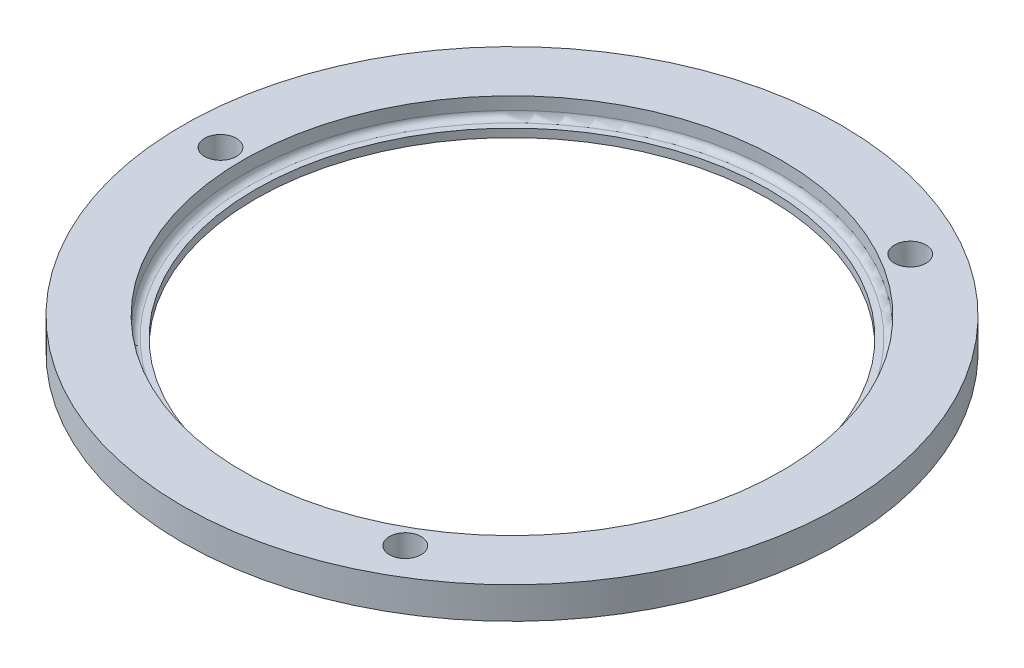
ISO-10303-21;
HEADER;
FILE_DESCRIPTION(('STEP AP214'),'2;1');
FILE_NAME('part.step','',(''),(''),'','','');
FILE_SCHEMA(('AUTOMOTIVE_DESIGN { 1 0 10303 214 1 1 1 1 }'));
ENDSEC;
DATA;
#1=APPLICATION_CONTEXT('core data for automotive mechanical design processes');
#2=APPLICATION_PROTOCOL_DEFINITION('international standard','automotive_design',2000,#1);
#3=PRODUCT_CONTEXT('',#1,'mechanical');
#4=PRODUCT('Part','Part','',(#3));
#5=PRODUCT_RELATED_PRODUCT_CATEGORY('part','',(#4));
#6=PRODUCT_DEFINITION_FORMATION('','',#4);
#7=PRODUCT_DEFINITION_CONTEXT('part definition',#1,'design');
#8=PRODUCT_DEFINITION('design','',#6,#7);
#9=PRODUCT_DEFINITION_SHAPE('','',#8);
#10=(LENGTH_UNIT() NAMED_UNIT(*) SI_UNIT(.MILLI.,.METRE.));
#11=(NAMED_UNIT(*) PLANE_ANGLE_UNIT() SI_UNIT($,.RADIAN.));
#12=(NAMED_UNIT(*) SI_UNIT($,.STERADIAN.) SOLID_ANGLE_UNIT());
#13=UNCERTAINTY_MEASURE_WITH_UNIT(LENGTH_MEASURE(1.E-05),#10,'distance_accuracy_value','');
#14=(GEOMETRIC_REPRESENTATION_CONTEXT(3) GLOBAL_UNCERTAINTY_ASSIGNED_CONTEXT((#13)) GLOBAL_UNIT_ASSIGNED_CONTEXT((#10,
#11,#12)) REPRESENTATION_CONTEXT('',''));
#15=CARTESIAN_POINT('',(0.,0.,0.));
#16=DIRECTION('',(0.,0.,1.));
#17=DIRECTION('',(1.,0.,0.));
#18=AXIS2_PLACEMENT_3D('',#15,#16,#17);
#19=CARTESIAN_POINT('',(42.5,4.14913308704831,0.));
#20=DIRECTION('',(0.,1.,0.));
#21=DIRECTION('',(0.,0.,1.));
#22=AXIS2_PLACEMENT_3D('',#19,#20,#21);
#23=PLANE('',#22);
#24=CARTESIAN_POINT('',(22.9999999999996,4.14913308704831,39.8371685740844));
#25=DIRECTION('',(0.,1.,0.));
#26=DIRECTION('',(0.,0.,1.));
#27=AXIS2_PLACEMENT_3D('',#24,#25,#26);
#28=CIRCLE('',#27,2.5);
#29=CARTESIAN_POINT('',(22.9999999999996,4.14913308704831,42.3371685740844));
#30=VERTEX_POINT('',#29);
#31=EDGE_CURVE('E210',#30,#30,#28,.T.);
#32=ORIENTED_EDGE('',*,*,#31,.F.);
#33=EDGE_LOOP('',(#32));
#34=FACE_BOUND('',#33,.T.);
#35=CARTESIAN_POINT('',(23.0000000000002,4.14913308704831,-39.8371685740841));
#36=DIRECTION('',(0.,1.,0.));
#37=DIRECTION('',(0.,0.,1.));
#38=AXIS2_PLACEMENT_3D('',#35,#36,#37);
#39=CIRCLE('',#38,2.5);
#40=CARTESIAN_POINT('',(23.0000000000002,4.14913308704831,-37.3371685740841));
#41=VERTEX_POINT('',#40);
#42=EDGE_CURVE('E211',#41,#41,#39,.T.);
#43=ORIENTED_EDGE('',*,*,#42,.F.);
#44=EDGE_LOOP('',(#43));
#45=FACE_BOUND('',#44,.T.);
#46=CARTESIAN_POINT('',(-46.,4.14913308704831,0.));
#47=DIRECTION('',(0.,1.,0.));
#48=DIRECTION('',(0.,0.,1.));
#49=AXIS2_PLACEMENT_3D('',#46,#47,#48);
#50=CIRCLE('',#49,2.5);
#51=CARTESIAN_POINT('',(-46.,4.14913308704831,2.5));
#52=VERTEX_POINT('',#51);
#53=EDGE_CURVE('E214',#52,#52,#50,.T.);
#54=ORIENTED_EDGE('',*,*,#53,.F.);
#55=EDGE_LOOP('',(#54));
#56=FACE_BOUND('',#55,.T.);
#57=CARTESIAN_POINT('',(0.,4.14913308704831,0.));
#58=DIRECTION('',(0.,-1.,0.));
#59=DIRECTION('',(0.,0.,-1.));
#60=AXIS2_PLACEMENT_3D('',#57,#58,#59);
#61=CIRCLE('',#60,42.5);
#62=CARTESIAN_POINT('',(0.,4.14913308704831,-42.5));
#63=VERTEX_POINT('',#62);
#64=EDGE_CURVE('E119',#63,#63,#61,.T.);
#65=ORIENTED_EDGE('',*,*,#64,.T.);
#66=EDGE_LOOP('',(#65));
#67=FACE_BOUND('',#66,.T.);
#68=CARTESIAN_POINT('',(0.,4.14913308704831,0.));
#69=DIRECTION('',(0.,-1.,0.));
#70=DIRECTION('',(0.,0.,-1.));
#71=AXIS2_PLACEMENT_3D('',#68,#69,#70);
#72=CIRCLE('',#71,52.);
#73=CARTESIAN_POINT('',(0.,4.14913308704831,-52.));
#74=VERTEX_POINT('',#73);
#75=EDGE_CURVE('E122',#74,#74,#72,.T.);
#76=ORIENTED_EDGE('',*,*,#75,.F.);
#77=EDGE_LOOP('',(#76));
#78=FACE_BOUND('',#77,.T.);
#79=ADVANCED_FACE('F31',(#34,#45,#56,#67,#78),#23,.T.);
#80=CARTESIAN_POINT('',(0.,-12.6426525828884,0.));
#81=DIRECTION('',(0.,-1.,0.));
#82=DIRECTION('',(0.,0.,-1.));
#83=AXIS2_PLACEMENT_3D('',#80,#81,#82);
#84=CYLINDRICAL_SURFACE('',#83,42.5);
#85=CARTESIAN_POINT('',(0.,2.14913308704831,0.));
#86=DIRECTION('',(0.,1.,0.));
#87=DIRECTION('',(0.,0.,1.));
#88=AXIS2_PLACEMENT_3D('',#85,#86,#87);
#89=CIRCLE('',#88,42.5);
#90=CARTESIAN_POINT('',(0.,2.14913308704831,42.5));
#91=VERTEX_POINT('',#90);
#92=EDGE_CURVE('E128',#91,#91,#89,.F.);
#93=ORIENTED_EDGE('',*,*,#92,.T.);
#94=EDGE_LOOP('',(#93));
#95=FACE_BOUND('',#94,.T.);
#96=ORIENTED_EDGE('',*,*,#64,.F.);
#97=EDGE_LOOP('',(#96));
#98=FACE_BOUND('',#97,.T.);
#99=ADVANCED_FACE('F86',(#95,#98),#84,.F.);
#100=CARTESIAN_POINT('',(40.5,1.14913308704831,0.));
#101=DIRECTION('',(0.,1.,0.));
#102=DIRECTION('',(0.,0.,1.));
#103=AXIS2_PLACEMENT_3D('',#100,#101,#102);
#104=PLANE('',#103);
#105=CARTESIAN_POINT('',(0.,1.14913308704831,0.));
#106=DIRECTION('',(0.,1.,0.));
#107=DIRECTION('',(0.,0.,1.));
#108=AXIS2_PLACEMENT_3D('',#105,#106,#107);
#109=CIRCLE('',#108,41.5);
#110=CARTESIAN_POINT('',(0.,1.14913308704831,41.5));
#111=VERTEX_POINT('',#110);
#112=EDGE_CURVE('E131',#111,#111,#109,.T.);
#113=ORIENTED_EDGE('',*,*,#112,.T.);
#114=EDGE_LOOP('',(#113));
#115=FACE_BOUND('',#114,.T.);
#116=CARTESIAN_POINT('',(0.,1.14913308704831,0.));
#117=DIRECTION('',(0.,-1.,0.));
#118=DIRECTION('',(0.,0.,-1.));
#119=AXIS2_PLACEMENT_3D('',#116,#117,#118);
#120=CIRCLE('',#119,40.5);
#121=CARTESIAN_POINT('',(0.,1.14913308704831,-40.5));
#122=VERTEX_POINT('',#121);
#123=EDGE_CURVE('E115',#122,#122,#120,.T.);
#124=ORIENTED_EDGE('',*,*,#123,.T.);
#125=EDGE_LOOP('',(#124));
#126=FACE_BOUND('',#125,.T.);
#127=ADVANCED_FACE('F92',(#115,#126),#104,.T.);
#128=CARTESIAN_POINT('',(0.,-12.6426525828884,0.));
#129=DIRECTION('',(0.,-1.,0.));
#130=DIRECTION('',(0.,0.,-1.));
#131=AXIS2_PLACEMENT_3D('',#128,#129,#130);
#132=CYLINDRICAL_SURFACE('',#131,40.5);
#133=CARTESIAN_POINT('',(0.,-0.150866912951693,0.));
#134=DIRECTION('',(0.,-1.,0.));
#135=DIRECTION('',(0.,0.,-1.));
#136=AXIS2_PLACEMENT_3D('',#133,#134,#135);
#137=CIRCLE('',#136,40.5);
#138=CARTESIAN_POINT('',(0.,-0.150866912951693,-40.5));
#139=VERTEX_POINT('',#138);
#140=EDGE_CURVE('E114',#139,#139,#137,.T.);
#141=ORIENTED_EDGE('',*,*,#140,.T.);
#142=EDGE_LOOP('',(#141));
#143=FACE_BOUND('',#142,.T.);
#144=ORIENTED_EDGE('',*,*,#123,.F.);
#145=EDGE_LOOP('',(#144));
#146=FACE_BOUND('',#145,.T.);
#147=ADVANCED_FACE('F100',(#143,#146),#132,.F.);
#148=CARTESIAN_POINT('',(42.5,-0.150866912951692,0.));
#149=DIRECTION('',(0.,-1.,0.));
#150=DIRECTION('',(0.,0.,-1.));
#151=AXIS2_PLACEMENT_3D('',#148,#149,#150);
#152=PLANE('',#151);
#153=CARTESIAN_POINT('',(0.,-0.150866912951692,0.));
#154=DIRECTION('',(0.,-1.,0.));
#155=DIRECTION('',(0.,0.,-1.));
#156=AXIS2_PLACEMENT_3D('',#153,#154,#155);
#157=CIRCLE('',#156,41.9428355748233);
#158=CARTESIAN_POINT('',(0.,-0.150866912951692,-41.9428355748233));
#159=VERTEX_POINT('',#158);
#160=EDGE_CURVE('E111',#159,#159,#157,.T.);
#161=ORIENTED_EDGE('',*,*,#160,.T.);
#162=EDGE_LOOP('',(#161));
#163=FACE_BOUND('',#162,.T.);
#164=ORIENTED_EDGE('',*,*,#140,.F.);
#165=EDGE_LOOP('',(#164));
#166=FACE_BOUND('',#165,.T.);
#167=ADVANCED_FACE('F81',(#163,#166),#152,.T.);
#168=CARTESIAN_POINT('',(0.,8.26825479858823,0.));
#169=DIRECTION('',(0.,-1.,0.));
#170=DIRECTION('',(0.,0.,-1.));
#171=AXIS2_PLACEMENT_3D('',#168,#169,#170);
#172=TOROIDAL_SURFACE('',#171,47.896145810324,10.);
#173=CARTESIAN_POINT('',(21.2038022403106,-0.76253138723925,38.098297213664));
#174=CARTESIAN_POINT('',(21.2910907376313,-0.745250180700136,38.0081285634641));
#175=CARTESIAN_POINT('',(21.3855929844703,-0.732188331248606,37.9241389232669));
#176=CARTESIAN_POINT('',(21.5867434436602,-0.71575351344506,37.7710961514514));
#177=CARTESIAN_POINT('',(21.6933865096505,-0.712376455597399,37.7020367268006));
#178=CARTESIAN_POINT('',(21.9158178065615,-0.715655535648828,37.5809343466861));
#179=CARTESIAN_POINT('',(22.0316085391252,-0.722314427175626,37.5288960661909));
#180=CARTESIAN_POINT('',(22.2689094797872,-0.744991060261475,37.4431266515805));
#181=CARTESIAN_POINT('',(22.3904213830819,-0.761011591946991,37.4094009811063));
#182=CARTESIAN_POINT('',(22.6365286442923,-0.801029791530192,37.360532599469));
#183=CARTESIAN_POINT('',(22.7611376051424,-0.825072294724352,37.3454966298342));
#184=CARTESIAN_POINT('',(23.0098861966885,-0.87914605723139,37.3340862791451));
#185=CARTESIAN_POINT('',(23.1340256686766,-0.909179184298609,37.3377177269798));
#186=CARTESIAN_POINT('',(23.3907927246126,-0.976128877213017,37.3642260404791));
#187=CARTESIAN_POINT('',(23.5231401474261,-1.01342547642065,37.3888560604312));
#188=CARTESIAN_POINT('',(23.7816612351028,-1.09011036656576,37.4587333870264));
#189=CARTESIAN_POINT('',(23.9078320076844,-1.12949961974527,37.5039902520534));
#190=CARTESIAN_POINT('',(24.1614241547587,-1.2112463962461,37.6186113067683));
#191=CARTESIAN_POINT('',(24.2881016394562,-1.25358281139312,37.6896463293335));
#192=CARTESIAN_POINT('',(24.5279030417355,-1.33537387046145,37.8530909305636));
#193=CARTESIAN_POINT('',(24.6410264994886,-1.37482841659589,37.9455012340864));
#194=CARTESIAN_POINT('',(24.8502536436406,-1.44874876061753,38.1495953565993));
#195=CARTESIAN_POINT('',(24.946361281936,-1.48321571652392,38.2612746884602));
#196=CARTESIAN_POINT('',(25.1181017885262,-1.54565388302979,38.5009944718408));
#197=CARTESIAN_POINT('',(25.193742004159,-1.57362742410316,38.6290290278465));
#198=CARTESIAN_POINT('',(25.3181597693545,-1.62106185713021,38.8905919384294));
#199=CARTESIAN_POINT('',(25.3681323559888,-1.64089056553023,39.0234857229583));
#200=CARTESIAN_POINT('',(25.444962982721,-1.67408886411362,39.2965570462016));
#201=CARTESIAN_POINT('',(25.4718253122746,-1.68745965273835,39.4367332281187));
#202=CARTESIAN_POINT('',(25.5008105782692,-1.70805703533897,39.7151911566065));
#203=CARTESIAN_POINT('',(25.5037438287791,-1.7154771272913,39.8533751944464));
#204=CARTESIAN_POINT('',(25.4867892935764,-1.72595505924023,40.1284991948168));
#205=CARTESIAN_POINT('',(25.4669013521574,-1.72901286947314,40.2654391488526));
#206=CARTESIAN_POINT('',(25.4047391825767,-1.73205014651254,40.5345616514021));
#207=CARTESIAN_POINT('',(25.3624037530687,-1.73202115400185,40.6667301335101));
#208=CARTESIAN_POINT('',(25.2564863386647,-1.73022032682294,40.9222491015313));
#209=CARTESIAN_POINT('',(25.1929029537036,-1.72844837729326,41.0455990057225));
#210=CARTESIAN_POINT('',(25.0452779841854,-1.72438696328273,41.2816281776379));
#211=CARTESIAN_POINT('',(24.9609804965412,-1.7220910532166,41.3941473699794));
#212=CARTESIAN_POINT('',(24.7747404293854,-1.71803574214814,41.6034997492288));
#213=CARTESIAN_POINT('',(24.6727976543058,-1.71627634709276,41.7003327622592));
#214=CARTESIAN_POINT('',(24.4537828588268,-1.71394768326633,41.8758622111785));
#215=CARTESIAN_POINT('',(24.3366633424693,-1.71338225139489,41.9544994548403));
#216=CARTESIAN_POINT('',(24.090886119049,-1.71365062872421,42.0909935601305));
#217=CARTESIAN_POINT('',(23.9622284224009,-1.714484436662,42.1488504405158));
#218=CARTESIAN_POINT('',(23.6972333235818,-1.71725568150075,42.2420730531342));
#219=CARTESIAN_POINT('',(23.5609074547432,-1.71919149891226,42.277471628555));
#220=CARTESIAN_POINT('',(23.2842530825323,-1.72342044654256,42.3249182452122));
#221=CARTESIAN_POINT('',(23.1439244542378,-1.72571358792308,42.3369655568679));
#222=CARTESIAN_POINT('',(22.8629963773031,-1.7295505526022,42.3373668063759));
#223=CARTESIAN_POINT('',(22.7223968533172,-1.73109317656255,42.3256829746488));
#224=CARTESIAN_POINT('',(22.4451443953533,-1.73207172571293,42.2788684109971));
#225=CARTESIAN_POINT('',(22.308491380466,-1.73150769412353,42.2437381601161));
#226=CARTESIAN_POINT('',(22.0435567955644,-1.7268556910241,42.1512191869284));
#227=CARTESIAN_POINT('',(21.9152464016672,-1.72278063184259,42.0939124468666));
#228=CARTESIAN_POINT('',(21.6702046331725,-1.70982757040226,41.9587752236081));
#229=CARTESIAN_POINT('',(21.5534717787766,-1.70095018289799,41.8809473680094));
#230=CARTESIAN_POINT('',(21.3364390299058,-1.67756857340657,41.7084055707638));
#231=CARTESIAN_POINT('',(21.2359407561055,-1.66314096539523,41.6139306495809));
#232=CARTESIAN_POINT('',(21.0522640176288,-1.6281802574485,41.4104178715104));
#233=CARTESIAN_POINT('',(20.9690847882008,-1.60764742719677,41.3013806579946));
#234=CARTESIAN_POINT('',(20.8221892619301,-1.56060442251804,41.0723315857665));
#235=CARTESIAN_POINT('',(20.7584438266321,-1.53410330154875,40.9523365115436));
#236=CARTESIAN_POINT('',(20.6514891121761,-1.47577475546412,40.7047473118039));
#237=CARTESIAN_POINT('',(20.6082829208564,-1.44394653045209,40.5771520469288));
#238=CARTESIAN_POINT('',(20.5418810472423,-1.37499900660534,40.3133721736292));
#239=CARTESIAN_POINT('',(20.5194095611377,-1.33773743951073,40.1770430134952));
#240=CARTESIAN_POINT('',(20.4970997908778,-1.26054902955199,39.9032756283224));
#241=CARTESIAN_POINT('',(20.4972700334034,-1.22062118824953,39.7658370049525));
#242=CARTESIAN_POINT('',(20.520626395055,-1.13814398087376,39.4857757436124));
#243=CARTESIAN_POINT('',(20.5450234436424,-1.09556724594119,39.3432609949684));
#244=CARTESIAN_POINT('',(20.6182212021335,-1.01276391884709,39.0638754413389));
#245=CARTESIAN_POINT('',(20.667024809523,-0.972537606355261,38.927005308557));
#246=CARTESIAN_POINT('',(20.7859710809775,-0.899172558386645,38.6677197342592));
#247=CARTESIAN_POINT('',(20.8551982473642,-0.865817177142952,38.544947398754));
#248=CARTESIAN_POINT('',(21.0144495141806,-0.807334991079394,38.3115553914912));
#249=CARTESIAN_POINT('',(21.1044534541858,-0.782200266245457,38.2009240914182));
#250=CARTESIAN_POINT('',(21.2038022403106,-0.76253138723925,38.098297213664));
#251=B_SPLINE_CURVE_WITH_KNOTS('',3,(#173,#174,#175,#176,#177,#178,#179,#180,#181,#182,#183,
#184,#185,#186,#187,#188,#189,#190,#191,#192,#193,#194,#195,#196,#197,#198,#199,#200,#201,#202,
#203,#204,#205,#206,#207,#208,#209,#210,#211,#212,#213,#214,#215,#216,#217,#218,#219,#220,#221,
#222,#223,#224,#225,#226,#227,#228,#229,#230,#231,#232,#233,#234,#235,#236,#237,#238,#239,#240,
#241,#242,#243,#244,#245,#246,#247,#248,#249,#250),.UNSPECIFIED.,.T.,.F.,(4,2,2,2,2,2,2,2,2,2,2,
2,2,2,2,2,2,2,2,2,2,2,2,2,2,2,2,2,2,2,2,2,2,2,2,2,2,2,4),(0.,0.379576061098025,
0.758991818966531,1.13851169852012,1.51814474723087,1.89993615828153,2.28184679069147,
2.69916691632933,3.1166806230969,3.568388912231,4.02011252150938,4.47173108069472,
4.92318730338979,5.35110337070456,5.77893999609897,6.19222592715865,6.60551467803771,
7.01993606701146,7.4343847683264,7.85423655767406,8.274093000661,8.69529664648658,
9.11649991212489,9.53708577853981,9.95768478541669,10.3789537261072,10.8002140240077,
11.2199316551463,11.6395955701979,12.0536631566393,12.4677124553483,12.8811378524506,
13.294625383645,13.7220613909902,14.1496583675254,14.5997611754547,15.0499174311552,
15.4823557978078,15.9143763053164),.UNSPECIFIED.);
#252=CARTESIAN_POINT('',(21.2038022403106,-0.76253138723925,38.098297213664));
#253=VERTEX_POINT('',#252);
#254=EDGE_CURVE('E10',#253,#253,#251,.T.);
#255=ORIENTED_EDGE('',*,*,#254,.F.);
#256=EDGE_LOOP('',(#255));
#257=FACE_BOUND('',#256,.T.);
#258=CARTESIAN_POINT('',(21.1852842672434,-1.65319523313979,-41.5567053748781));
#259=CARTESIAN_POINT('',(21.2795969054049,-1.66977569467074,-41.6562352311481));
#260=CARTESIAN_POINT('',(21.3823911149567,-1.68332790879927,-41.7482675377722));
#261=CARTESIAN_POINT('',(21.6021179983916,-1.70492047896112,-41.914404440758));
#262=CARTESIAN_POINT('',(21.7190554725012,-1.71295895742143,-41.9885029246251));
#263=CARTESIAN_POINT('',(21.9636529039215,-1.72451289514927,-42.1164278109481));
#264=CARTESIAN_POINT('',(22.0913069440086,-1.72803083319089,-42.1702653117635));
#265=CARTESIAN_POINT('',(22.3537820629541,-1.73181732936013,-42.2561505188197));
#266=CARTESIAN_POINT('',(22.4886032691241,-1.73208582974806,-42.2881978378581));
#267=CARTESIAN_POINT('',(22.7627320635995,-1.73072041016581,-42.3297718163868));
#268=CARTESIAN_POINT('',(22.902066317146,-1.7290717354984,-42.339122078548));
#269=CARTESIAN_POINT('',(23.1803428108828,-1.72514326645279,-42.3345358970695));
#270=CARTESIAN_POINT('',(23.3192850362823,-1.72286344857582,-42.3205985862875));
#271=CARTESIAN_POINT('',(23.5942413554526,-1.71870906489785,-42.269577377515));
#272=CARTESIAN_POINT('',(23.730214734917,-1.71683858351082,-42.2322733779674));
#273=CARTESIAN_POINT('',(23.9939827767414,-1.7142444169337,-42.1353720853227));
#274=CARTESIAN_POINT('',(24.121777453107,-1.71352072977971,-42.0757748304034));
#275=CARTESIAN_POINT('',(24.3655013693653,-1.71347361941474,-41.9360090394073));
#276=CARTESIAN_POINT('',(24.4814356468344,-1.71414959909736,-41.8558492881983));
#277=CARTESIAN_POINT('',(24.6982088539998,-1.71666427621979,-41.6772261056064));
#278=CARTESIAN_POINT('',(24.7990475673985,-1.71850299031795,-41.5787624119997));
#279=CARTESIAN_POINT('',(24.9827665611898,-1.72264568302803,-41.3663364054101));
#280=CARTESIAN_POINT('',(25.0656489840147,-1.72494960607069,-41.2523759440485));
#281=CARTESIAN_POINT('',(25.2111354192241,-1.7289480227363,-41.0121571751259));
#282=CARTESIAN_POINT('',(25.2737389343818,-1.73064250141615,-40.8858985661203));
#283=CARTESIAN_POINT('',(25.3769317805608,-1.73209494202166,-40.6245382292177));
#284=CARTESIAN_POINT('',(25.4175016674321,-1.73185119646766,-40.4894288081154));
#285=CARTESIAN_POINT('',(25.4753736228069,-1.72799703730449,-40.2143603276549));
#286=CARTESIAN_POINT('',(25.4926774430902,-1.72438687719861,-40.0744016342285));
#287=CARTESIAN_POINT('',(25.5035162227549,-1.7125202462537,-39.7950006543894));
#288=CARTESIAN_POINT('',(25.4972601362085,-1.7043051689738,-39.6555647559234));
#289=CARTESIAN_POINT('',(25.4617834852234,-1.6822465253775,-39.38011257529));
#290=CARTESIAN_POINT('',(25.4325657390639,-1.6684036499091,-39.2440958755697));
#291=CARTESIAN_POINT('',(25.3528154282899,-1.63474336649822,-38.9810588386003));
#292=CARTESIAN_POINT('',(25.3025417985389,-1.61499934545699,-38.8539504051864));
#293=CARTESIAN_POINT('',(25.1825632787761,-1.56950581549025,-38.6104472762109));
#294=CARTESIAN_POINT('',(25.1128574695339,-1.54375602247384,-38.4940530878284));
#295=CARTESIAN_POINT('',(24.9553746988783,-1.48648401980494,-38.2734833958416));
#296=CARTESIAN_POINT('',(24.867377806434,-1.45489212923037,-38.1694833995783));
#297=CARTESIAN_POINT('',(24.6765866742542,-1.38732130480966,-37.9777705674385));
#298=CARTESIAN_POINT('',(24.5737890083207,-1.3513413554774,-37.8900615135111));
#299=CARTESIAN_POINT('',(24.3509771250589,-1.27483205762064,-37.7289355155631));
#300=CARTESIAN_POINT('',(24.2303785785351,-1.23416802399429,-37.6563907420619));
#301=CARTESIAN_POINT('',(23.9789368922274,-1.15204902048743,-37.532533920899));
#302=CARTESIAN_POINT('',(23.8480895472901,-1.11059373128143,-37.4812306436174));
#303=CARTESIAN_POINT('',(23.5734222833347,-1.02782626484867,-37.399429555471));
#304=CARTESIAN_POINT('',(23.4292881035975,-0.986593645143949,-37.3698989774509));
#305=CARTESIAN_POINT('',(23.1366173519516,-0.909498669438631,-37.3365662903161));
#306=CARTESIAN_POINT('',(22.9880813464407,-0.873635626079768,-37.3327608853696));
#307=CARTESIAN_POINT('',(22.6957713642513,-0.811881735224078,-37.3515786003924));
#308=CARTESIAN_POINT('',(22.5520053863292,-0.785695859162042,-37.3733164576836));
#309=CARTESIAN_POINT('',(22.2689858565972,-0.744622749067042,-37.4420147781427));
#310=CARTESIAN_POINT('',(22.1297277481499,-0.729723741492119,-37.4889488710583));
#311=CARTESIAN_POINT('',(21.8748807992108,-0.713973993430965,-37.6007794061355));
#312=CARTESIAN_POINT('',(21.7583331063369,-0.711830676588529,-37.6633185608783));
#313=CARTESIAN_POINT('',(21.5367887601456,-0.718369100000056,-37.80582723768));
#314=CARTESIAN_POINT('',(21.4317900694421,-0.727048927574324,-37.8857936779064));
#315=CARTESIAN_POINT('',(21.2410677349917,-0.753627140068131,-38.0562302342613));
#316=CARTESIAN_POINT('',(21.1546622887223,-0.771064653598912,-38.1460148554687));
#317=CARTESIAN_POINT('',(20.9968130074795,-0.813323787273795,-38.336323293817));
#318=CARTESIAN_POINT('',(20.9253727204095,-0.838147155069698,-38.4368496490709));
#319=CARTESIAN_POINT('',(20.7943836916676,-0.895072292056797,-38.65299929866));
#320=CARTESIAN_POINT('',(20.7359185861351,-0.927543964945558,-38.7691799991892));
#321=CARTESIAN_POINT('',(20.6379016789909,-0.996316625645586,-39.0081961385657));
#322=CARTESIAN_POINT('',(20.5983583523611,-1.03261932048655,-39.1310345319942));
#323=CARTESIAN_POINT('',(20.5356731087103,-1.11048214987663,-39.3932978020015));
#324=CARTESIAN_POINT('',(20.5145478383684,-1.15220654095604,-39.5331590902654));
#325=CARTESIAN_POINT('',(20.4961211874195,-1.2348685529833,-39.8147175938845));
#326=CARTESIAN_POINT('',(20.4988283789599,-1.27580588553279,-39.956415451524));
#327=CARTESIAN_POINT('',(20.5288462643816,-1.35599104520332,-40.2432843015586));
#328=CARTESIAN_POINT('',(20.5570387635196,-1.39512507366174,-40.3883968000081));
#329=CARTESIAN_POINT('',(20.6390803767791,-1.46795147899702,-40.6725652942389));
#330=CARTESIAN_POINT('',(20.6929099261113,-1.50164797928714,-40.8116258203802));
#331=CARTESIAN_POINT('',(20.8139222619583,-1.55706353801026,-41.0563561378125));
#332=CARTESIAN_POINT('',(20.8772873022728,-1.57984479928701,-41.1636869981477));
#333=CARTESIAN_POINT('',(21.0198325551739,-1.62032648009852,-41.3683370711617));
#334=CARTESIAN_POINT('',(21.0990096869968,-1.63802788773663,-41.4656582285032));
#335=CARTESIAN_POINT('',(21.1852842672434,-1.65319523313979,-41.5567053748781));
#336=B_SPLINE_CURVE_WITH_KNOTS('',3,(#258,#259,#260,#261,#262,#263,#264,#265,#266,#267,#268,
#269,#270,#271,#272,#273,#274,#275,#276,#277,#278,#279,#280,#281,#282,#283,#284,#285,#286,#287,
#288,#289,#290,#291,#292,#293,#294,#295,#296,#297,#298,#299,#300,#301,#302,#303,#304,#305,#306,
#307,#308,#309,#310,#311,#312,#313,#314,#315,#316,#317,#318,#319,#320,#321,#322,#323,#324,#325,
#326,#327,#328,#329,#330,#331,#332,#333,#334,#335),.UNSPECIFIED.,.T.,.F.,(4,2,2,2,2,2,2,2,2,2,2,
2,2,2,2,2,2,2,2,2,2,2,2,2,2,2,2,2,2,2,2,2,2,2,2,2,2,2,4),(0.,0.413894338097584,
0.827929548300101,1.24173763116556,1.65555306703371,2.07257444663749,2.4896113549061,
2.91063684871426,3.33166162151059,3.75250681957743,4.17335804717474,4.59415903375027,
5.01497033733653,5.43615239590823,5.85730274049845,6.27472671350876,6.69209946053808,
7.10448364735331,7.51688734512595,7.93457084545928,8.35235119033091,8.78989112384721,
9.22761153306627,9.6837668051997,10.1398636349833,10.5806084191053,11.0208928186989,
11.4156807469351,11.8103989176387,12.1862341488206,12.5621583815127,12.9626745647979,
13.3633699700038,13.8038225427277,14.2444335455217,14.7008991016739,15.1570168651927,
15.5357096138031,15.914328651314),.UNSPECIFIED.);
#337=CARTESIAN_POINT('',(21.1852842672434,-1.65319523313979,-41.5567053748781));
#338=VERTEX_POINT('',#337);
#339=EDGE_CURVE('E42',#338,#338,#336,.T.);
#340=ORIENTED_EDGE('',*,*,#339,.F.);
#341=EDGE_LOOP('',(#340));
#342=FACE_BOUND('',#341,.T.);
#343=CARTESIAN_POINT('',(-47.7683575365333,-1.73129288090521,-1.7671761743236));
#344=CARTESIAN_POINT('',(-47.6706542886893,-1.73039753085354,-1.8649406267632));
#345=CARTESIAN_POINT('',(-47.5648067368174,-1.72809774566925,-1.95460160713559));
#346=CARTESIAN_POINT('',(-47.3398401126784,-1.71936929684385,-2.11516824928498));
#347=CARTESIAN_POINT('',(-47.2207170293953,-1.71293938253153,-2.18606822073354));
#348=CARTESIAN_POINT('',(-46.9726890437434,-1.69483832242238,-2.30714552860476));
#349=CARTESIAN_POINT('',(-46.8437817888718,-1.68316591278311,-2.3573178624784));
#350=CARTESIAN_POINT('',(-46.5801121531513,-1.65386448778315,-2.43564844682196));
#351=CARTESIAN_POINT('',(-46.4453504930307,-1.63623620384175,-2.46380939902336));
#352=CARTESIAN_POINT('',(-46.1746249751148,-1.59493693446139,-2.49760479529334));
#353=CARTESIAN_POINT('',(-46.0386698491175,-1.57129500153974,-2.50334543265335));
#354=CARTESIAN_POINT('',(-45.7687334567589,-1.51832390264947,-2.49294384206266));
#355=CARTESIAN_POINT('',(-45.6347524388166,-1.48899402738454,-2.47679888343444));
#356=CARTESIAN_POINT('',(-45.3689314670585,-1.42479781613215,-2.42293228198194));
#357=CARTESIAN_POINT('',(-45.2372276313383,-1.38981192924793,-2.38468401222741));
#358=CARTESIAN_POINT('',(-44.9826329293925,-1.3163625130303,-2.28769264060646));
#359=CARTESIAN_POINT('',(-44.8597446082041,-1.27789798660216,-2.22894364866423));
#360=CARTESIAN_POINT('',(-44.619300311706,-1.19734798128473,-2.08902299845983));
#361=CARTESIAN_POINT('',(-44.5023621821644,-1.15517840167786,-2.00683680240448));
#362=CARTESIAN_POINT('',(-44.2839167442814,-1.07173855417816,-1.82356746736871));
#363=CARTESIAN_POINT('',(-44.1824155681587,-1.03046864922245,-1.72247685411304));
#364=CARTESIAN_POINT('',(-43.9952074954321,-0.950857832820299,-1.50078965387063));
#365=CARTESIAN_POINT('',(-43.9099573246434,-0.912615564555181,-1.37976968691547));
#366=CARTESIAN_POINT('',(-43.761470970315,-0.843779474511483,-1.12292226977862));
#367=CARTESIAN_POINT('',(-43.6982224852186,-0.813181381436634,-0.987103150051812));
#368=CARTESIAN_POINT('',(-43.5998780280656,-0.764663438064477,-0.713553930269882));
#369=CARTESIAN_POINT('',(-43.5632366956401,-0.746056345733328,-0.576505015762563));
#370=CARTESIAN_POINT('',(-43.5136826750007,-0.720729876776363,-0.297152347711386));
#371=CARTESIAN_POINT('',(-43.5007493470427,-0.714000160120101,-0.154853275078309));
#372=CARTESIAN_POINT('',(-43.4993854282628,-0.713290543102791,0.115525514648205));
#373=CARTESIAN_POINT('',(-43.5086235204968,-0.718097558935076,0.243597400397229));
#374=CARTESIAN_POINT('',(-43.546392930609,-0.737472357128065,0.496090169463585));
#375=CARTESIAN_POINT('',(-43.5749250165105,-0.752040528044432,0.620510907236352));
#376=CARTESIAN_POINT('',(-43.6496668462306,-0.789336920403349,0.861203770126513));
#377=CARTESIAN_POINT('',(-43.6957005527652,-0.811983748282879,0.977543819817243));
#378=CARTESIAN_POINT('',(-43.8038440315194,-0.863572249132092,1.20096508745658));
#379=CARTESIAN_POINT('',(-43.8659587446706,-0.892515856366577,1.30804344621248));
#380=CARTESIAN_POINT('',(-44.0106899810716,-0.957404908057629,1.52004637372124));
#381=CARTESIAN_POINT('',(-44.094633204241,-0.99374308169986,1.62394435493943));
#382=CARTESIAN_POINT('',(-44.2774022667194,-1.06891181558855,1.81667672139221));
#383=CARTESIAN_POINT('',(-44.3762351364457,-1.10774354821799,1.90550394834492));
#384=CARTESIAN_POINT('',(-44.595849135369,-1.18896087067259,2.07342270340646));
#385=CARTESIAN_POINT('',(-44.7177917819909,-1.23136167146411,2.15099444240666));
#386=CARTESIAN_POINT('',(-44.9738716114715,-1.31373046081621,2.28427128943074));
#387=CARTESIAN_POINT('',(-45.1080098566445,-1.35369823693759,2.33997449031375));
#388=CARTESIAN_POINT('',(-45.3861447593885,-1.42931541000723,2.42787939362581));
#389=CARTESIAN_POINT('',(-45.5302069191006,-1.46493072758609,2.45990445807111));
#390=CARTESIAN_POINT('',(-45.8231056787739,-1.5298416109237,2.49809871061307));
#391=CARTESIAN_POINT('',(-45.971940582206,-1.55913939433852,2.50427698581711));
#392=CARTESIAN_POINT('',(-46.2620248312926,-1.6092179018144,2.49025167419428));
#393=CARTESIAN_POINT('',(-46.4032767800203,-1.63035469141096,2.47136772547562));
#394=CARTESIAN_POINT('',(-46.6812846556215,-1.66604711763847,2.40958776479263));
#395=CARTESIAN_POINT('',(-46.8180415155013,-1.68060412807808,2.36669676950995));
#396=CARTESIAN_POINT('',(-47.0776672092101,-1.70328126458766,2.25999927715987));
#397=CARTESIAN_POINT('',(-47.2008642207706,-1.7116218496605,2.19703538078042));
#398=CARTESIAN_POINT('',(-47.4353478473948,-1.72371843072734,2.05153919567213));
#399=CARTESIAN_POINT('',(-47.546634516078,-1.72747444736149,1.96900699504359));
#400=CARTESIAN_POINT('',(-47.7541167300486,-1.73165644016365,1.78666088349475));
#401=CARTESIAN_POINT('',(-47.8503086204069,-1.73208161104273,1.68684279937807));
#402=CARTESIAN_POINT('',(-48.0248992252317,-1.73095340943496,1.47270845886208));
#403=CARTESIAN_POINT('',(-48.1032967499431,-1.72939990469709,1.3583912338269));
#404=CARTESIAN_POINT('',(-48.2410633441955,-1.72556645116626,1.11679334777939));
#405=CARTESIAN_POINT('',(-48.3001650679357,-1.72327710250142,0.989360306897536));
#406=CARTESIAN_POINT('',(-48.3962333998284,-1.71907304129183,0.726402331695613));
#407=CARTESIAN_POINT('',(-48.4331999082407,-1.71715833043522,0.590877360916683));
#408=CARTESIAN_POINT('',(-48.4840596791294,-1.71442924760448,0.31496946788104));
#409=CARTESIAN_POINT('',(-48.4978567513177,-1.71361946544811,0.174568751202879));
#410=CARTESIAN_POINT('',(-48.5016808339164,-1.71340017581401,-0.106569237857923));
#411=CARTESIAN_POINT('',(-48.4917059264534,-1.71399078131659,-0.24730653648017));
#412=CARTESIAN_POINT('',(-48.448303882079,-1.71636401532088,-0.524900118960759));
#413=CARTESIAN_POINT('',(-48.4149092659458,-1.71814499070548,-0.661761511077939));
#414=CARTESIAN_POINT('',(-48.3256569785643,-1.72222794783807,-0.927902507147496));
#415=CARTESIAN_POINT('',(-48.2698082002077,-1.72452972316745,-1.05718508946219));
#416=CARTESIAN_POINT('',(-48.1458501270338,-1.72833550603996,-1.28851041730874));
#417=CARTESIAN_POINT('',(-48.0802630073275,-1.72990420685343,-1.3919131243411));
#418=CARTESIAN_POINT('',(-47.9346898799047,-1.73177851833542,-1.58804548499709));
#419=CARTESIAN_POINT('',(-47.8547042223258,-1.73208415971416,-1.68077539806739));
#420=CARTESIAN_POINT('',(-47.7683575365333,-1.73129288090521,-1.7671761743236));
#421=B_SPLINE_CURVE_WITH_KNOTS('',3,(#343,#344,#345,#346,#347,#348,#349,#350,#351,#352,#353,
#354,#355,#356,#357,#358,#359,#360,#361,#362,#363,#364,#365,#366,#367,#368,#369,#370,#371,#372,
#373,#374,#375,#376,#377,#378,#379,#380,#381,#382,#383,#384,#385,#386,#387,#388,#389,#390,#391,
#392,#393,#394,#395,#396,#397,#398,#399,#400,#401,#402,#403,#404,#405,#406,#407,#408,#409,#410,
#411,#412,#413,#414,#415,#416,#417,#418,#419,#420),.UNSPECIFIED.,.T.,.F.,(4,2,2,2,2,2,2,2,2,2,2,
2,2,2,2,2,2,2,2,2,2,2,2,2,2,2,2,2,2,2,2,2,2,2,2,2,2,2,4),(0.,0.414228671826155,
0.828582838097694,1.24303694908304,1.65744018095291,2.06987820410569,2.48236769210793,
2.90511580805389,3.32798548417571,3.77303695223826,4.21826475459843,4.67458975791892,
5.13065920969706,5.5574795842178,5.98392820013042,6.36752998917574,6.75114704890384,
7.13100348316805,7.51097676812029,7.92452927829214,8.33827767035711,8.7880295633498,
9.23782067020185,9.69093425110509,10.1438885148126,10.5739138930799,11.0038494437442,
11.4176988694056,11.8315464318719,12.2454940459791,12.6594693290299,13.0789583178584,
13.4984491968718,13.9196773684675,14.3409395250174,14.7616178691569,15.1821297689846,
15.5482193661988,15.9143000622009),.UNSPECIFIED.);
#422=CARTESIAN_POINT('',(-47.7683575365333,-1.73129288090521,-1.7671761743236));
#423=VERTEX_POINT('',#422);
#424=EDGE_CURVE('E46',#423,#423,#421,.T.);
#425=ORIENTED_EDGE('',*,*,#424,.F.);
#426=EDGE_LOOP('',(#425));
#427=FACE_BOUND('',#426,.T.);
#428=CARTESIAN_POINT('',(0.,-0.414346627695039,0.));
#429=DIRECTION('',(0.,1.,0.));
#430=DIRECTION('',(0.,0.,1.));
#431=AXIS2_PLACEMENT_3D('',#428,#429,#430);
#432=CIRCLE('',#431,42.9350539474067);
#433=CARTESIAN_POINT('',(0.,-0.414346627695039,42.9350539474067));
#434=VERTEX_POINT('',#433);
#435=EDGE_CURVE('E50',#434,#434,#432,.T.);
#436=ORIENTED_EDGE('',*,*,#435,.T.);
#437=EDGE_LOOP('',(#436));
#438=FACE_BOUND('',#437,.T.);
#439=CARTESIAN_POINT('',(0.,-0.850866912951692,0.));
#440=DIRECTION('',(0.,-1.,0.));
#441=DIRECTION('',(0.,0.,-1.));
#442=AXIS2_PLACEMENT_3D('',#439,#440,#441);
#443=CIRCLE('',#442,52.);
#444=CARTESIAN_POINT('',(0.,-0.850866912951692,-52.));
#445=VERTEX_POINT('',#444);
#446=EDGE_CURVE('E116',#445,#445,#443,.T.);
#447=ORIENTED_EDGE('',*,*,#446,.T.);
#448=EDGE_LOOP('',(#447));
#449=FACE_BOUND('',#448,.T.);
#450=ADVANCED_FACE('F59',(#257,#342,#427,#438,#449),#172,.T.);
#451=CARTESIAN_POINT('',(0.,-12.6426525828884,0.));
#452=DIRECTION('',(0.,-1.,0.));
#453=DIRECTION('',(0.,0.,-1.));
#454=AXIS2_PLACEMENT_3D('',#451,#452,#453);
#455=CYLINDRICAL_SURFACE('',#454,52.);
#456=ORIENTED_EDGE('',*,*,#75,.T.);
#457=EDGE_LOOP('',(#456));
#458=FACE_BOUND('',#457,.T.);
#459=ORIENTED_EDGE('',*,*,#446,.F.);
#460=EDGE_LOOP('',(#459));
#461=FACE_BOUND('',#460,.T.);
#462=ADVANCED_FACE('F72',(#458,#461),#455,.T.);
#463=CARTESIAN_POINT('',(0.,2.14913308704831,0.));
#464=DIRECTION('',(0.,1.,0.));
#465=DIRECTION('',(0.,0.,1.));
#466=AXIS2_PLACEMENT_3D('',#463,#464,#465);
#467=TOROIDAL_SURFACE('',#466,41.5,1.);
#468=ORIENTED_EDGE('',*,*,#112,.F.);
#469=EDGE_LOOP('',(#468));
#470=FACE_BOUND('',#469,.T.);
#471=ORIENTED_EDGE('',*,*,#92,.F.);
#472=EDGE_LOOP('',(#471));
#473=FACE_BOUND('',#472,.T.);
#474=ADVANCED_FACE('F74',(#470,#473),#467,.F.);
#475=CARTESIAN_POINT('',(0.,-2.15086691295169,0.));
#476=DIRECTION('',(0.,1.,0.));
#477=DIRECTION('',(0.,0.,1.));
#478=AXIS2_PLACEMENT_3D('',#475,#476,#477);
#479=TOROIDAL_SURFACE('',#478,41.9428355748233,2.);
#480=ORIENTED_EDGE('',*,*,#435,.F.);
#481=EDGE_LOOP('',(#480));
#482=FACE_BOUND('',#481,.T.);
#483=ORIENTED_EDGE('',*,*,#160,.F.);
#484=EDGE_LOOP('',(#483));
#485=FACE_BOUND('',#484,.T.);
#486=ADVANCED_FACE('F33',(#482,#485),#479,.F.);
#487=CARTESIAN_POINT('',(-46.,-1.73174520141178,0.));
#488=DIRECTION('',(0.,1.,0.));
#489=DIRECTION('',(0.,0.,1.));
#490=AXIS2_PLACEMENT_3D('',#487,#488,#489);
#491=CYLINDRICAL_SURFACE('',#490,2.5);
#492=ORIENTED_EDGE('',*,*,#424,.T.);
#493=EDGE_LOOP('',(#492));
#494=FACE_BOUND('',#493,.T.);
#495=ORIENTED_EDGE('',*,*,#53,.T.);
#496=EDGE_LOOP('',(#495));
#497=FACE_BOUND('',#496,.T.);
#498=ADVANCED_FACE('F67',(#494,#497),#491,.F.);
#499=CARTESIAN_POINT('',(23.0000000000002,-1.73174520141178,-39.8371685740841));
#500=DIRECTION('',(0.,1.,0.));
#501=DIRECTION('',(0.,0.,1.));
#502=AXIS2_PLACEMENT_3D('',#499,#500,#501);
#503=CYLINDRICAL_SURFACE('',#502,2.5);
#504=ORIENTED_EDGE('',*,*,#339,.T.);
#505=EDGE_LOOP('',(#504));
#506=FACE_BOUND('',#505,.T.);
#507=ORIENTED_EDGE('',*,*,#42,.T.);
#508=EDGE_LOOP('',(#507));
#509=FACE_BOUND('',#508,.T.);
#510=ADVANCED_FACE('F63',(#506,#509),#503,.F.);
#511=CARTESIAN_POINT('',(22.9999999999996,-1.73174520141178,39.8371685740844));
#512=DIRECTION('',(0.,1.,0.));
#513=DIRECTION('',(0.,0.,1.));
#514=AXIS2_PLACEMENT_3D('',#511,#512,#513);
#515=CYLINDRICAL_SURFACE('',#514,2.5);
#516=ORIENTED_EDGE('',*,*,#254,.T.);
#517=EDGE_LOOP('',(#516));
#518=FACE_BOUND('',#517,.T.);
#519=ORIENTED_EDGE('',*,*,#31,.T.);
#520=EDGE_LOOP('',(#519));
#521=FACE_BOUND('',#520,.T.);
#522=ADVANCED_FACE('F66',(#518,#521),#515,.F.);
#523=CLOSED_SHELL('',(#79,#99,#127,#147,#167,#450,#462,#474,#486,#498,#510,#522));
#524=MANIFOLD_SOLID_BREP('B2',#523);
#525=ADVANCED_BREP_SHAPE_REPRESENTATION('',(#18,#524),#14);
#526=SHAPE_DEFINITION_REPRESENTATION(#9,#525);
ENDSEC;
END-ISO-10303-21;
